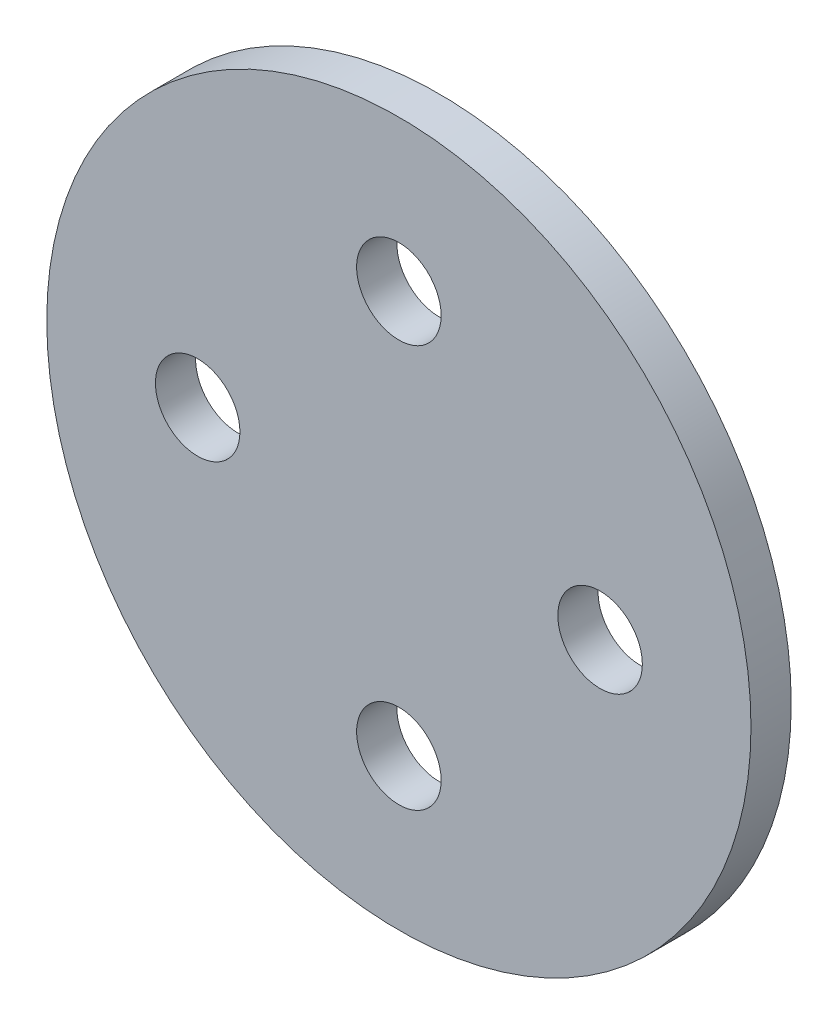
ISO-10303-21;
HEADER;
FILE_DESCRIPTION(('STEP AP214'),'2;1');
FILE_NAME('part.step','',(''),(''),'','','');
FILE_SCHEMA(('AUTOMOTIVE_DESIGN { 1 0 10303 214 1 1 1 1 }'));
ENDSEC;
DATA;
#1=APPLICATION_CONTEXT('core data for automotive mechanical design processes');
#2=APPLICATION_PROTOCOL_DEFINITION('international standard','automotive_design',2000,#1);
#3=PRODUCT_CONTEXT('',#1,'mechanical');
#4=PRODUCT('Part','Part','',(#3));
#5=PRODUCT_RELATED_PRODUCT_CATEGORY('part','',(#4));
#6=PRODUCT_DEFINITION_FORMATION('','',#4);
#7=PRODUCT_DEFINITION_CONTEXT('part definition',#1,'design');
#8=PRODUCT_DEFINITION('design','',#6,#7);
#9=PRODUCT_DEFINITION_SHAPE('','',#8);
#10=(LENGTH_UNIT() NAMED_UNIT(*) SI_UNIT(.MILLI.,.METRE.));
#11=(NAMED_UNIT(*) PLANE_ANGLE_UNIT() SI_UNIT($,.RADIAN.));
#12=(NAMED_UNIT(*) SI_UNIT($,.STERADIAN.) SOLID_ANGLE_UNIT());
#13=UNCERTAINTY_MEASURE_WITH_UNIT(LENGTH_MEASURE(1.E-05),#10,'distance_accuracy_value','');
#14=(GEOMETRIC_REPRESENTATION_CONTEXT(3) GLOBAL_UNCERTAINTY_ASSIGNED_CONTEXT((#13)) GLOBAL_UNIT_ASSIGNED_CONTEXT((#10,
#11,#12)) REPRESENTATION_CONTEXT('',''));
#15=CARTESIAN_POINT('',(0.,0.,0.));
#16=DIRECTION('',(0.,0.,1.));
#17=DIRECTION('',(1.,0.,0.));
#18=AXIS2_PLACEMENT_3D('',#15,#16,#17);
#19=CARTESIAN_POINT('',(0.,0.,2.));
#20=DIRECTION('',(0.,0.,1.));
#21=DIRECTION('',(1.,0.,0.));
#22=AXIS2_PLACEMENT_3D('',#19,#20,#21);
#23=PLANE('',#22);
#24=CARTESIAN_POINT('',(5.64760248210638E-13,-10.,2.));
#25=DIRECTION('',(0.,0.,1.));
#26=DIRECTION('',(1.,0.,0.));
#27=AXIS2_PLACEMENT_3D('',#24,#25,#26);
#28=CIRCLE('',#27,2.10000000000061);
#29=CARTESIAN_POINT('',(2.10000000000117,-10.,2.));
#30=VERTEX_POINT('',#29);
#31=EDGE_CURVE('E54',#30,#30,#28,.T.);
#32=ORIENTED_EDGE('',*,*,#31,.F.);
#33=EDGE_LOOP('',(#32));
#34=FACE_BOUND('',#33,.T.);
#35=CARTESIAN_POINT('',(0.,10.,2.));
#36=DIRECTION('',(0.,0.,1.));
#37=DIRECTION('',(1.,0.,0.));
#38=AXIS2_PLACEMENT_3D('',#35,#36,#37);
#39=CIRCLE('',#38,2.1);
#40=CARTESIAN_POINT('',(2.1,10.,2.));
#41=VERTEX_POINT('',#40);
#42=EDGE_CURVE('E43',#41,#41,#39,.T.);
#43=ORIENTED_EDGE('',*,*,#42,.F.);
#44=EDGE_LOOP('',(#43));
#45=FACE_BOUND('',#44,.T.);
#46=CARTESIAN_POINT('',(0.,0.,2.));
#47=DIRECTION('',(0.,0.,1.));
#48=DIRECTION('',(1.,0.,0.));
#49=AXIS2_PLACEMENT_3D('',#46,#47,#48);
#50=CIRCLE('',#49,17.5);
#51=CARTESIAN_POINT('',(17.5,0.,2.));
#52=VERTEX_POINT('',#51);
#53=EDGE_CURVE('E10',#52,#52,#50,.T.);
#54=ORIENTED_EDGE('',*,*,#53,.T.);
#55=EDGE_LOOP('',(#54));
#56=FACE_BOUND('',#55,.T.);
#57=CARTESIAN_POINT('',(10.0000000000003,2.82380124105319E-13,2.));
#58=DIRECTION('',(0.,0.,1.));
#59=DIRECTION('',(1.,0.,0.));
#60=AXIS2_PLACEMENT_3D('',#57,#58,#59);
#61=CIRCLE('',#60,2.10000000000022);
#62=CARTESIAN_POINT('',(12.1000000000005,2.82380124105319E-13,2.));
#63=VERTEX_POINT('',#62);
#64=EDGE_CURVE('E48',#63,#63,#61,.T.);
#65=ORIENTED_EDGE('',*,*,#64,.F.);
#66=EDGE_LOOP('',(#65));
#67=FACE_BOUND('',#66,.T.);
#68=CARTESIAN_POINT('',(-9.99999999999972,-2.83604770904466E-13,2.));
#69=DIRECTION('',(0.,0.,1.));
#70=DIRECTION('',(1.,0.,0.));
#71=AXIS2_PLACEMENT_3D('',#68,#69,#70);
#72=CIRCLE('',#71,2.10000000000045);
#73=CARTESIAN_POINT('',(-7.89999999999926,-2.83604770904466E-13,2.));
#74=VERTEX_POINT('',#73);
#75=EDGE_CURVE('E60',#74,#74,#72,.T.);
#76=ORIENTED_EDGE('',*,*,#75,.F.);
#77=EDGE_LOOP('',(#76));
#78=FACE_BOUND('',#77,.T.);
#79=ADVANCED_FACE('F32',(#34,#45,#56,#67,#78),#23,.T.);
#80=CARTESIAN_POINT('',(0.,0.,0.));
#81=DIRECTION('',(0.,0.,1.));
#82=DIRECTION('',(1.,0.,0.));
#83=AXIS2_PLACEMENT_3D('',#80,#81,#82);
#84=PLANE('',#83);
#85=CARTESIAN_POINT('',(0.,0.,0.));
#86=DIRECTION('',(0.,0.,1.));
#87=DIRECTION('',(1.,0.,0.));
#88=AXIS2_PLACEMENT_3D('',#85,#86,#87);
#89=CIRCLE('',#88,17.5);
#90=CARTESIAN_POINT('',(17.5,0.,0.));
#91=VERTEX_POINT('',#90);
#92=EDGE_CURVE('E36',#91,#91,#89,.T.);
#93=ORIENTED_EDGE('',*,*,#92,.F.);
#94=EDGE_LOOP('',(#93));
#95=FACE_BOUND('',#94,.T.);
#96=CARTESIAN_POINT('',(0.,10.,0.));
#97=DIRECTION('',(0.,0.,1.));
#98=DIRECTION('',(1.,0.,0.));
#99=AXIS2_PLACEMENT_3D('',#96,#97,#98);
#100=CIRCLE('',#99,2.1);
#101=CARTESIAN_POINT('',(2.1,10.,0.));
#102=VERTEX_POINT('',#101);
#103=EDGE_CURVE('E45',#102,#102,#100,.T.);
#104=ORIENTED_EDGE('',*,*,#103,.T.);
#105=EDGE_LOOP('',(#104));
#106=FACE_BOUND('',#105,.T.);
#107=CARTESIAN_POINT('',(10.0000000000003,2.82380124105319E-13,0.));
#108=DIRECTION('',(0.,0.,1.));
#109=DIRECTION('',(1.,0.,0.));
#110=AXIS2_PLACEMENT_3D('',#107,#108,#109);
#111=CIRCLE('',#110,2.10000000000022);
#112=CARTESIAN_POINT('',(12.1000000000005,2.82380124105319E-13,0.));
#113=VERTEX_POINT('',#112);
#114=EDGE_CURVE('E51',#113,#113,#111,.T.);
#115=ORIENTED_EDGE('',*,*,#114,.T.);
#116=EDGE_LOOP('',(#115));
#117=FACE_BOUND('',#116,.T.);
#118=CARTESIAN_POINT('',(5.64760248210638E-13,-10.,0.));
#119=DIRECTION('',(0.,0.,1.));
#120=DIRECTION('',(1.,0.,0.));
#121=AXIS2_PLACEMENT_3D('',#118,#119,#120);
#122=CIRCLE('',#121,2.10000000000061);
#123=CARTESIAN_POINT('',(2.10000000000117,-10.,0.));
#124=VERTEX_POINT('',#123);
#125=EDGE_CURVE('E57',#124,#124,#122,.T.);
#126=ORIENTED_EDGE('',*,*,#125,.T.);
#127=EDGE_LOOP('',(#126));
#128=FACE_BOUND('',#127,.T.);
#129=CARTESIAN_POINT('',(-9.99999999999972,-2.83604770904466E-13,0.));
#130=DIRECTION('',(0.,0.,1.));
#131=DIRECTION('',(1.,0.,0.));
#132=AXIS2_PLACEMENT_3D('',#129,#130,#131);
#133=CIRCLE('',#132,2.10000000000045);
#134=CARTESIAN_POINT('',(-7.89999999999926,-2.83604770904466E-13,0.));
#135=VERTEX_POINT('',#134);
#136=EDGE_CURVE('E63',#135,#135,#133,.T.);
#137=ORIENTED_EDGE('',*,*,#136,.T.);
#138=EDGE_LOOP('',(#137));
#139=FACE_BOUND('',#138,.T.);
#140=ADVANCED_FACE('F73',(#95,#106,#117,#128,#139),#84,.F.);
#141=CARTESIAN_POINT('',(0.,0.,2.));
#142=DIRECTION('',(0.,0.,-1.));
#143=DIRECTION('',(-1.,0.,0.));
#144=AXIS2_PLACEMENT_3D('',#141,#142,#143);
#145=CYLINDRICAL_SURFACE('',#144,17.5);
#146=ORIENTED_EDGE('',*,*,#53,.F.);
#147=EDGE_LOOP('',(#146));
#148=FACE_BOUND('',#147,.T.);
#149=ORIENTED_EDGE('',*,*,#92,.T.);
#150=EDGE_LOOP('',(#149));
#151=FACE_BOUND('',#150,.T.);
#152=ADVANCED_FACE('F34',(#148,#151),#145,.T.);
#153=CARTESIAN_POINT('',(0.,10.,2.));
#154=DIRECTION('',(0.,0.,-1.));
#155=DIRECTION('',(-1.,0.,0.));
#156=AXIS2_PLACEMENT_3D('',#153,#154,#155);
#157=CYLINDRICAL_SURFACE('',#156,2.1);
#158=ORIENTED_EDGE('',*,*,#42,.T.);
#159=EDGE_LOOP('',(#158));
#160=FACE_BOUND('',#159,.T.);
#161=ORIENTED_EDGE('',*,*,#103,.F.);
#162=EDGE_LOOP('',(#161));
#163=FACE_BOUND('',#162,.T.);
#164=ADVANCED_FACE('F83',(#160,#163),#157,.F.);
#165=CARTESIAN_POINT('',(10.0000000000003,2.82380124105319E-13,2.));
#166=DIRECTION('',(0.,0.,-1.));
#167=DIRECTION('',(-1.,0.,0.));
#168=AXIS2_PLACEMENT_3D('',#165,#166,#167);
#169=CYLINDRICAL_SURFACE('',#168,2.10000000000022);
#170=ORIENTED_EDGE('',*,*,#64,.T.);
#171=EDGE_LOOP('',(#170));
#172=FACE_BOUND('',#171,.T.);
#173=ORIENTED_EDGE('',*,*,#114,.F.);
#174=EDGE_LOOP('',(#173));
#175=FACE_BOUND('',#174,.T.);
#176=ADVANCED_FACE('F86',(#172,#175),#169,.F.);
#177=CARTESIAN_POINT('',(5.64760248210638E-13,-10.,2.));
#178=DIRECTION('',(0.,0.,-1.));
#179=DIRECTION('',(-1.,0.,0.));
#180=AXIS2_PLACEMENT_3D('',#177,#178,#179);
#181=CYLINDRICAL_SURFACE('',#180,2.10000000000061);
#182=ORIENTED_EDGE('',*,*,#31,.T.);
#183=EDGE_LOOP('',(#182));
#184=FACE_BOUND('',#183,.T.);
#185=ORIENTED_EDGE('',*,*,#125,.F.);
#186=EDGE_LOOP('',(#185));
#187=FACE_BOUND('',#186,.T.);
#188=ADVANCED_FACE('F90',(#184,#187),#181,.F.);
#189=CARTESIAN_POINT('',(-9.99999999999972,-2.83604770904466E-13,2.));
#190=DIRECTION('',(0.,0.,-1.));
#191=DIRECTION('',(-1.,0.,0.));
#192=AXIS2_PLACEMENT_3D('',#189,#190,#191);
#193=CYLINDRICAL_SURFACE('',#192,2.10000000000045);
#194=ORIENTED_EDGE('',*,*,#75,.T.);
#195=EDGE_LOOP('',(#194));
#196=FACE_BOUND('',#195,.T.);
#197=ORIENTED_EDGE('',*,*,#136,.F.);
#198=EDGE_LOOP('',(#197));
#199=FACE_BOUND('',#198,.T.);
#200=ADVANCED_FACE('F69',(#196,#199),#193,.F.);
#201=CLOSED_SHELL('',(#79,#140,#152,#164,#176,#188,#200));
#202=MANIFOLD_SOLID_BREP('B2',#201);
#203=ADVANCED_BREP_SHAPE_REPRESENTATION('',(#18,#202),#14);
#204=SHAPE_DEFINITION_REPRESENTATION(#9,#203);
ENDSEC;
END-ISO-10303-21;
